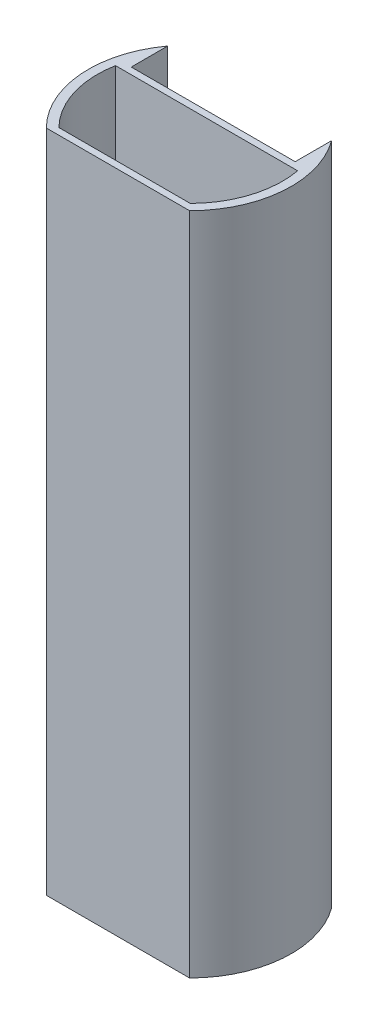
ISO-10303-21;
HEADER;
FILE_DESCRIPTION(('STEP AP214'),'2;1');
FILE_NAME('part.step','',(''),(''),'','','');
FILE_SCHEMA(('AUTOMOTIVE_DESIGN { 1 0 10303 214 1 1 1 1 }'));
ENDSEC;
DATA;
#1=APPLICATION_CONTEXT('core data for automotive mechanical design processes');
#2=APPLICATION_PROTOCOL_DEFINITION('international standard','automotive_design',2000,#1);
#3=PRODUCT_CONTEXT('',#1,'mechanical');
#4=PRODUCT('Part','Part','',(#3));
#5=PRODUCT_RELATED_PRODUCT_CATEGORY('part','',(#4));
#6=PRODUCT_DEFINITION_FORMATION('','',#4);
#7=PRODUCT_DEFINITION_CONTEXT('part definition',#1,'design');
#8=PRODUCT_DEFINITION('design','',#6,#7);
#9=PRODUCT_DEFINITION_SHAPE('','',#8);
#10=(LENGTH_UNIT() NAMED_UNIT(*) SI_UNIT(.MILLI.,.METRE.));
#11=(NAMED_UNIT(*) PLANE_ANGLE_UNIT() SI_UNIT($,.RADIAN.));
#12=(NAMED_UNIT(*) SI_UNIT($,.STERADIAN.) SOLID_ANGLE_UNIT());
#13=UNCERTAINTY_MEASURE_WITH_UNIT(LENGTH_MEASURE(1.E-05),#10,'distance_accuracy_value','');
#14=(GEOMETRIC_REPRESENTATION_CONTEXT(3) GLOBAL_UNCERTAINTY_ASSIGNED_CONTEXT((#13)) GLOBAL_UNIT_ASSIGNED_CONTEXT((#10,
#11,#12)) REPRESENTATION_CONTEXT('',''));
#15=CARTESIAN_POINT('',(0.,0.,0.));
#16=DIRECTION('',(0.,0.,1.));
#17=DIRECTION('',(1.,0.,0.));
#18=AXIS2_PLACEMENT_3D('',#15,#16,#17);
#19=CARTESIAN_POINT('',(0.,-155.,14.7297596498906));
#20=DIRECTION('',(0.,0.,1.));
#21=DIRECTION('',(1.,0.,0.));
#22=AXIS2_PLACEMENT_3D('',#19,#20,#21);
#23=PLANE('',#22);
#24=DIRECTION('',(1.,0.,0.));
#25=VECTOR('',#24,1.);
#26=CARTESIAN_POINT('',(0.,-5.,14.7297596498906));
#27=LINE('',#26,#25);
#28=CARTESIAN_POINT('',(-14.8271433747858,-5.,14.7297596498906));
#29=VERTEX_POINT('',#28);
#30=CARTESIAN_POINT('',(14.8271433747858,-5.,14.7297596498906));
#31=VERTEX_POINT('',#30);
#32=EDGE_CURVE('E164',#29,#31,#27,.T.);
#33=ORIENTED_EDGE('',*,*,#32,.T.);
#34=DIRECTION('',(0.,1.,0.));
#35=VECTOR('',#34,1.);
#36=CARTESIAN_POINT('',(14.8271433747858,-155.,14.7297596498906));
#37=LINE('',#36,#35);
#38=CARTESIAN_POINT('',(14.8271433747858,-155.,14.7297596498906));
#39=VERTEX_POINT('',#38);
#40=EDGE_CURVE('E11',#39,#31,#37,.T.);
#41=ORIENTED_EDGE('',*,*,#40,.F.);
#42=DIRECTION('',(1.,0.,0.));
#43=VECTOR('',#42,1.);
#44=CARTESIAN_POINT('',(0.,-155.,14.7297596498906));
#45=LINE('',#44,#43);
#46=CARTESIAN_POINT('',(-14.8271433747858,-155.,14.7297596498906));
#47=VERTEX_POINT('',#46);
#48=EDGE_CURVE('E138',#47,#39,#45,.T.);
#49=ORIENTED_EDGE('',*,*,#48,.F.);
#50=DIRECTION('',(0.,1.,0.));
#51=VECTOR('',#50,1.);
#52=CARTESIAN_POINT('',(-14.8271433747858,-155.,14.7297596498906));
#53=LINE('',#52,#51);
#54=EDGE_CURVE('E58',#47,#29,#53,.T.);
#55=ORIENTED_EDGE('',*,*,#54,.T.);
#56=EDGE_LOOP('',(#33,#41,#49,#55));
#57=FACE_BOUND('',#56,.T.);
#58=ADVANCED_FACE('F39',(#57),#23,.F.);
#59=CARTESIAN_POINT('',(0.,-155.,0.));
#60=DIRECTION('',(0.,1.,0.));
#61=DIRECTION('',(0.,0.,1.));
#62=AXIS2_PLACEMENT_3D('',#59,#60,#61);
#63=CYLINDRICAL_SURFACE('',#62,20.9);
#64=CARTESIAN_POINT('',(0.,-5.,0.));
#65=DIRECTION('',(0.,-1.,0.));
#66=DIRECTION('',(0.,0.,-1.));
#67=AXIS2_PLACEMENT_3D('',#64,#65,#66);
#68=CIRCLE('',#67,20.9);
#69=CARTESIAN_POINT('',(20.5571225540543,-5.,-3.7702403501094));
#70=VERTEX_POINT('',#69);
#71=EDGE_CURVE('E128',#70,#31,#68,.T.);
#72=ORIENTED_EDGE('',*,*,#71,.F.);
#73=DIRECTION('',(0.,1.,0.));
#74=VECTOR('',#73,1.);
#75=CARTESIAN_POINT('',(20.5571225540543,-155.,-3.7702403501094));
#76=LINE('',#75,#74);
#77=CARTESIAN_POINT('',(20.5571225540543,-155.,-3.7702403501094));
#78=VERTEX_POINT('',#77);
#79=EDGE_CURVE('E49',#78,#70,#76,.T.);
#80=ORIENTED_EDGE('',*,*,#79,.F.);
#81=CARTESIAN_POINT('',(0.,-155.,0.));
#82=DIRECTION('',(0.,-1.,0.));
#83=DIRECTION('',(0.,0.,-1.));
#84=AXIS2_PLACEMENT_3D('',#81,#82,#83);
#85=CIRCLE('',#84,20.9);
#86=EDGE_CURVE('E126',#78,#39,#85,.T.);
#87=ORIENTED_EDGE('',*,*,#86,.T.);
#88=ORIENTED_EDGE('',*,*,#40,.T.);
#89=EDGE_LOOP('',(#72,#80,#87,#88));
#90=FACE_BOUND('',#89,.T.);
#91=ADVANCED_FACE('F125',(#90),#63,.F.);
#92=CARTESIAN_POINT('',(0.,-155.,-3.7702403501094));
#93=DIRECTION('',(0.,0.,1.));
#94=DIRECTION('',(1.,0.,0.));
#95=AXIS2_PLACEMENT_3D('',#92,#93,#94);
#96=PLANE('',#95);
#97=DIRECTION('',(1.,0.,0.));
#98=VECTOR('',#97,1.);
#99=CARTESIAN_POINT('',(0.,-5.,-3.7702403501094));
#100=LINE('',#99,#98);
#101=CARTESIAN_POINT('',(-20.5571225540543,-5.,-3.7702403501094));
#102=VERTEX_POINT('',#101);
#103=EDGE_CURVE('E167',#102,#70,#100,.T.);
#104=ORIENTED_EDGE('',*,*,#103,.F.);
#105=DIRECTION('',(0.,1.,0.));
#106=VECTOR('',#105,1.);
#107=CARTESIAN_POINT('',(-20.5571225540543,-155.,-3.7702403501094));
#108=LINE('',#107,#106);
#109=CARTESIAN_POINT('',(-20.5571225540543,-155.,-3.7702403501094));
#110=VERTEX_POINT('',#109);
#111=EDGE_CURVE('E89',#110,#102,#108,.T.);
#112=ORIENTED_EDGE('',*,*,#111,.F.);
#113=DIRECTION('',(1.,0.,0.));
#114=VECTOR('',#113,1.);
#115=CARTESIAN_POINT('',(0.,-155.,-3.7702403501094));
#116=LINE('',#115,#114);
#117=EDGE_CURVE('E137',#110,#78,#116,.T.);
#118=ORIENTED_EDGE('',*,*,#117,.T.);
#119=ORIENTED_EDGE('',*,*,#79,.T.);
#120=EDGE_LOOP('',(#104,#112,#118,#119));
#121=FACE_BOUND('',#120,.T.);
#122=ADVANCED_FACE('F141',(#121),#96,.T.);
#123=CARTESIAN_POINT('',(0.,-155.,0.));
#124=DIRECTION('',(0.,1.,0.));
#125=DIRECTION('',(0.,0.,1.));
#126=AXIS2_PLACEMENT_3D('',#123,#124,#125);
#127=CYLINDRICAL_SURFACE('',#126,22.9);
#128=CARTESIAN_POINT('',(0.,-5.,0.));
#129=DIRECTION('',(0.,-1.,0.));
#130=DIRECTION('',(0.,0.,-1.));
#131=AXIS2_PLACEMENT_3D('',#128,#129,#130);
#132=CIRCLE('',#131,22.9);
#133=CARTESIAN_POINT('',(18.5,-5.,-13.4966662550424));
#134=VERTEX_POINT('',#133);
#135=CARTESIAN_POINT('',(16.1556461247077,-5.,16.2297596498906));
#136=VERTEX_POINT('',#135);
#137=EDGE_CURVE('E148',#134,#136,#132,.T.);
#138=ORIENTED_EDGE('',*,*,#137,.T.);
#139=DIRECTION('',(0.,1.,0.));
#140=VECTOR('',#139,1.);
#141=CARTESIAN_POINT('',(16.1556461247077,-155.,16.2297596498906));
#142=LINE('',#141,#140);
#143=CARTESIAN_POINT('',(16.1556461247077,-155.,16.2297596498906));
#144=VERTEX_POINT('',#143);
#145=EDGE_CURVE('E43',#144,#136,#142,.T.);
#146=ORIENTED_EDGE('',*,*,#145,.F.);
#147=CARTESIAN_POINT('',(0.,-155.,0.));
#148=DIRECTION('',(0.,-1.,0.));
#149=DIRECTION('',(0.,0.,-1.));
#150=AXIS2_PLACEMENT_3D('',#147,#148,#149);
#151=CIRCLE('',#150,22.9);
#152=CARTESIAN_POINT('',(18.5,-155.,-13.4966662550424));
#153=VERTEX_POINT('',#152);
#154=EDGE_CURVE('E102',#153,#144,#151,.T.);
#155=ORIENTED_EDGE('',*,*,#154,.F.);
#156=DIRECTION('',(0.,1.,0.));
#157=VECTOR('',#156,1.);
#158=CARTESIAN_POINT('',(18.5,-155.,-13.4966662550424));
#159=LINE('',#158,#157);
#160=EDGE_CURVE('E144',#153,#134,#159,.T.);
#161=ORIENTED_EDGE('',*,*,#160,.T.);
#162=EDGE_LOOP('',(#138,#146,#155,#161));
#163=FACE_BOUND('',#162,.T.);
#164=ADVANCED_FACE('F41',(#163),#127,.T.);
#165=CARTESIAN_POINT('',(0.,-155.,16.2297596498906));
#166=DIRECTION('',(0.,0.,1.));
#167=DIRECTION('',(1.,0.,0.));
#168=AXIS2_PLACEMENT_3D('',#165,#166,#167);
#169=PLANE('',#168);
#170=DIRECTION('',(1.,0.,0.));
#171=VECTOR('',#170,1.);
#172=CARTESIAN_POINT('',(0.,-5.,16.2297596498906));
#173=LINE('',#172,#171);
#174=CARTESIAN_POINT('',(-16.1556461247077,-5.,16.2297596498906));
#175=VERTEX_POINT('',#174);
#176=EDGE_CURVE('E151',#175,#136,#173,.T.);
#177=ORIENTED_EDGE('',*,*,#176,.F.);
#178=DIRECTION('',(0.,1.,0.));
#179=VECTOR('',#178,1.);
#180=CARTESIAN_POINT('',(-16.1556461247077,-155.,16.2297596498906));
#181=LINE('',#180,#179);
#182=CARTESIAN_POINT('',(-16.1556461247077,-155.,16.2297596498906));
#183=VERTEX_POINT('',#182);
#184=EDGE_CURVE('E182',#183,#175,#181,.T.);
#185=ORIENTED_EDGE('',*,*,#184,.F.);
#186=DIRECTION('',(1.,0.,0.));
#187=VECTOR('',#186,1.);
#188=CARTESIAN_POINT('',(0.,-155.,16.2297596498906));
#189=LINE('',#188,#187);
#190=EDGE_CURVE('E190',#183,#144,#189,.T.);
#191=ORIENTED_EDGE('',*,*,#190,.T.);
#192=ORIENTED_EDGE('',*,*,#145,.T.);
#193=EDGE_LOOP('',(#177,#185,#191,#192));
#194=FACE_BOUND('',#193,.T.);
#195=ADVANCED_FACE('F189',(#194),#169,.T.);
#196=CARTESIAN_POINT('',(0.,-155.,0.));
#197=DIRECTION('',(0.,1.,0.));
#198=DIRECTION('',(0.,0.,1.));
#199=AXIS2_PLACEMENT_3D('',#196,#197,#198);
#200=CYLINDRICAL_SURFACE('',#199,22.9);
#201=CARTESIAN_POINT('',(0.,-5.,0.));
#202=DIRECTION('',(0.,-1.,0.));
#203=DIRECTION('',(0.,0.,-1.));
#204=AXIS2_PLACEMENT_3D('',#201,#202,#203);
#205=CIRCLE('',#204,22.9);
#206=CARTESIAN_POINT('',(-18.5,-5.,-13.4966662550424));
#207=VERTEX_POINT('',#206);
#208=EDGE_CURVE('E154',#175,#207,#205,.T.);
#209=ORIENTED_EDGE('',*,*,#208,.T.);
#210=DIRECTION('',(0.,1.,0.));
#211=VECTOR('',#210,1.);
#212=CARTESIAN_POINT('',(-18.5,-155.,-13.4966662550424));
#213=LINE('',#212,#211);
#214=CARTESIAN_POINT('',(-18.5,-155.,-13.4966662550424));
#215=VERTEX_POINT('',#214);
#216=EDGE_CURVE('E181',#215,#207,#213,.T.);
#217=ORIENTED_EDGE('',*,*,#216,.F.);
#218=CARTESIAN_POINT('',(0.,-155.,0.));
#219=DIRECTION('',(0.,-1.,0.));
#220=DIRECTION('',(0.,0.,-1.));
#221=AXIS2_PLACEMENT_3D('',#218,#219,#220);
#222=CIRCLE('',#221,22.9);
#223=EDGE_CURVE('E203',#183,#215,#222,.T.);
#224=ORIENTED_EDGE('',*,*,#223,.F.);
#225=ORIENTED_EDGE('',*,*,#184,.T.);
#226=EDGE_LOOP('',(#209,#217,#224,#225));
#227=FACE_BOUND('',#226,.T.);
#228=ADVANCED_FACE('F201',(#227),#200,.T.);
#229=CARTESIAN_POINT('',(-18.5,-155.,0.));
#230=DIRECTION('',(1.,0.,0.));
#231=DIRECTION('',(0.,0.,-1.));
#232=AXIS2_PLACEMENT_3D('',#229,#230,#231);
#233=PLANE('',#232);
#234=DIRECTION('',(0.,0.,-1.));
#235=VECTOR('',#234,1.);
#236=CARTESIAN_POINT('',(-18.5,-5.,0.));
#237=LINE('',#236,#235);
#238=CARTESIAN_POINT('',(-18.5,-5.,-5.2702403501094));
#239=VERTEX_POINT('',#238);
#240=EDGE_CURVE('E157',#239,#207,#237,.T.);
#241=ORIENTED_EDGE('',*,*,#240,.F.);
#242=DIRECTION('',(0.,1.,0.));
#243=VECTOR('',#242,1.);
#244=CARTESIAN_POINT('',(-18.5,-155.,-5.2702403501094));
#245=LINE('',#244,#243);
#246=CARTESIAN_POINT('',(-18.5,-155.,-5.2702403501094));
#247=VERTEX_POINT('',#246);
#248=EDGE_CURVE('E179',#247,#239,#245,.T.);
#249=ORIENTED_EDGE('',*,*,#248,.F.);
#250=DIRECTION('',(0.,0.,-1.));
#251=VECTOR('',#250,1.);
#252=CARTESIAN_POINT('',(-18.5,-155.,0.));
#253=LINE('',#252,#251);
#254=EDGE_CURVE('E206',#247,#215,#253,.T.);
#255=ORIENTED_EDGE('',*,*,#254,.T.);
#256=ORIENTED_EDGE('',*,*,#216,.T.);
#257=EDGE_LOOP('',(#241,#249,#255,#256));
#258=FACE_BOUND('',#257,.T.);
#259=ADVANCED_FACE('F207',(#258),#233,.T.);
#260=CARTESIAN_POINT('',(0.,-155.,-5.2702403501094));
#261=DIRECTION('',(0.,0.,1.));
#262=DIRECTION('',(1.,0.,0.));
#263=AXIS2_PLACEMENT_3D('',#260,#261,#262);
#264=PLANE('',#263);
#265=DIRECTION('',(1.,0.,0.));
#266=VECTOR('',#265,1.);
#267=CARTESIAN_POINT('',(0.,-5.,-5.2702403501094));
#268=LINE('',#267,#266);
#269=CARTESIAN_POINT('',(18.5,-5.,-5.2702403501094));
#270=VERTEX_POINT('',#269);
#271=EDGE_CURVE('E160',#239,#270,#268,.T.);
#272=ORIENTED_EDGE('',*,*,#271,.T.);
#273=DIRECTION('',(0.,1.,0.));
#274=VECTOR('',#273,1.);
#275=CARTESIAN_POINT('',(18.5,-155.,-5.2702403501094));
#276=LINE('',#275,#274);
#277=CARTESIAN_POINT('',(18.5,-155.,-5.2702403501094));
#278=VERTEX_POINT('',#277);
#279=EDGE_CURVE('E176',#278,#270,#276,.T.);
#280=ORIENTED_EDGE('',*,*,#279,.F.);
#281=DIRECTION('',(1.,0.,0.));
#282=VECTOR('',#281,1.);
#283=CARTESIAN_POINT('',(0.,-155.,-5.2702403501094));
#284=LINE('',#283,#282);
#285=EDGE_CURVE('E209',#247,#278,#284,.T.);
#286=ORIENTED_EDGE('',*,*,#285,.F.);
#287=ORIENTED_EDGE('',*,*,#248,.T.);
#288=EDGE_LOOP('',(#272,#280,#286,#287));
#289=FACE_BOUND('',#288,.T.);
#290=ADVANCED_FACE('F222',(#289),#264,.F.);
#291=CARTESIAN_POINT('',(18.5,-155.,0.));
#292=DIRECTION('',(1.,0.,0.));
#293=DIRECTION('',(0.,0.,-1.));
#294=AXIS2_PLACEMENT_3D('',#291,#292,#293);
#295=PLANE('',#294);
#296=DIRECTION('',(0.,0.,-1.));
#297=VECTOR('',#296,1.);
#298=CARTESIAN_POINT('',(18.5,-5.,0.));
#299=LINE('',#298,#297);
#300=EDGE_CURVE('E162',#270,#134,#299,.T.);
#301=ORIENTED_EDGE('',*,*,#300,.T.);
#302=ORIENTED_EDGE('',*,*,#160,.F.);
#303=DIRECTION('',(0.,0.,-1.));
#304=VECTOR('',#303,1.);
#305=CARTESIAN_POINT('',(18.5,-155.,0.));
#306=LINE('',#305,#304);
#307=EDGE_CURVE('E211',#278,#153,#306,.T.);
#308=ORIENTED_EDGE('',*,*,#307,.F.);
#309=ORIENTED_EDGE('',*,*,#279,.T.);
#310=EDGE_LOOP('',(#301,#302,#308,#309));
#311=FACE_BOUND('',#310,.T.);
#312=ADVANCED_FACE('F219',(#311),#295,.F.);
#313=CARTESIAN_POINT('',(0.,-155.,0.));
#314=DIRECTION('',(0.,1.,0.));
#315=DIRECTION('',(0.,0.,1.));
#316=AXIS2_PLACEMENT_3D('',#313,#314,#315);
#317=CYLINDRICAL_SURFACE('',#316,20.9);
#318=CARTESIAN_POINT('',(0.,-5.,0.));
#319=DIRECTION('',(0.,-1.,0.));
#320=DIRECTION('',(0.,0.,-1.));
#321=AXIS2_PLACEMENT_3D('',#318,#319,#320);
#322=CIRCLE('',#321,20.9);
#323=EDGE_CURVE('E169',#29,#102,#322,.T.);
#324=ORIENTED_EDGE('',*,*,#323,.F.);
#325=ORIENTED_EDGE('',*,*,#54,.F.);
#326=CARTESIAN_POINT('',(0.,-155.,0.));
#327=DIRECTION('',(0.,-1.,0.));
#328=DIRECTION('',(0.,0.,-1.));
#329=AXIS2_PLACEMENT_3D('',#326,#327,#328);
#330=CIRCLE('',#329,20.9);
#331=EDGE_CURVE('E142',#47,#110,#330,.T.);
#332=ORIENTED_EDGE('',*,*,#331,.T.);
#333=ORIENTED_EDGE('',*,*,#111,.T.);
#334=EDGE_LOOP('',(#324,#325,#332,#333));
#335=FACE_BOUND('',#334,.T.);
#336=ADVANCED_FACE('F229',(#335),#317,.F.);
#337=CARTESIAN_POINT('',(0.,-155.,0.));
#338=DIRECTION('',(0.,-1.,0.));
#339=DIRECTION('',(0.,0.,-1.));
#340=AXIS2_PLACEMENT_3D('',#337,#338,#339);
#341=PLANE('',#340);
#342=ORIENTED_EDGE('',*,*,#154,.T.);
#343=ORIENTED_EDGE('',*,*,#190,.F.);
#344=ORIENTED_EDGE('',*,*,#223,.T.);
#345=ORIENTED_EDGE('',*,*,#254,.F.);
#346=ORIENTED_EDGE('',*,*,#285,.T.);
#347=ORIENTED_EDGE('',*,*,#307,.T.);
#348=EDGE_LOOP('',(#342,#343,#344,#345,#346,#347));
#349=FACE_BOUND('',#348,.T.);
#350=ORIENTED_EDGE('',*,*,#48,.T.);
#351=ORIENTED_EDGE('',*,*,#86,.F.);
#352=ORIENTED_EDGE('',*,*,#117,.F.);
#353=ORIENTED_EDGE('',*,*,#331,.F.);
#354=EDGE_LOOP('',(#350,#351,#352,#353));
#355=FACE_BOUND('',#354,.T.);
#356=ADVANCED_FACE('F135',(#349,#355),#341,.T.);
#357=CARTESIAN_POINT('',(0.,-5.,0.));
#358=DIRECTION('',(0.,-1.,0.));
#359=DIRECTION('',(0.,0.,-1.));
#360=AXIS2_PLACEMENT_3D('',#357,#358,#359);
#361=PLANE('',#360);
#362=ORIENTED_EDGE('',*,*,#137,.F.);
#363=ORIENTED_EDGE('',*,*,#300,.F.);
#364=ORIENTED_EDGE('',*,*,#271,.F.);
#365=ORIENTED_EDGE('',*,*,#240,.T.);
#366=ORIENTED_EDGE('',*,*,#208,.F.);
#367=ORIENTED_EDGE('',*,*,#176,.T.);
#368=EDGE_LOOP('',(#362,#363,#364,#365,#366,#367));
#369=FACE_BOUND('',#368,.T.);
#370=ORIENTED_EDGE('',*,*,#32,.F.);
#371=ORIENTED_EDGE('',*,*,#323,.T.);
#372=ORIENTED_EDGE('',*,*,#103,.T.);
#373=ORIENTED_EDGE('',*,*,#71,.T.);
#374=EDGE_LOOP('',(#370,#371,#372,#373));
#375=FACE_BOUND('',#374,.T.);
#376=ADVANCED_FACE('F196',(#369,#375),#361,.F.);
#377=CLOSED_SHELL('',(#58,#91,#122,#164,#195,#228,#259,#290,#312,#336,#356,#376));
#378=MANIFOLD_SOLID_BREP('B2',#377);
#379=ADVANCED_BREP_SHAPE_REPRESENTATION('',(#18,#378),#14);
#380=SHAPE_DEFINITION_REPRESENTATION(#9,#379);
ENDSEC;
END-ISO-10303-21;
